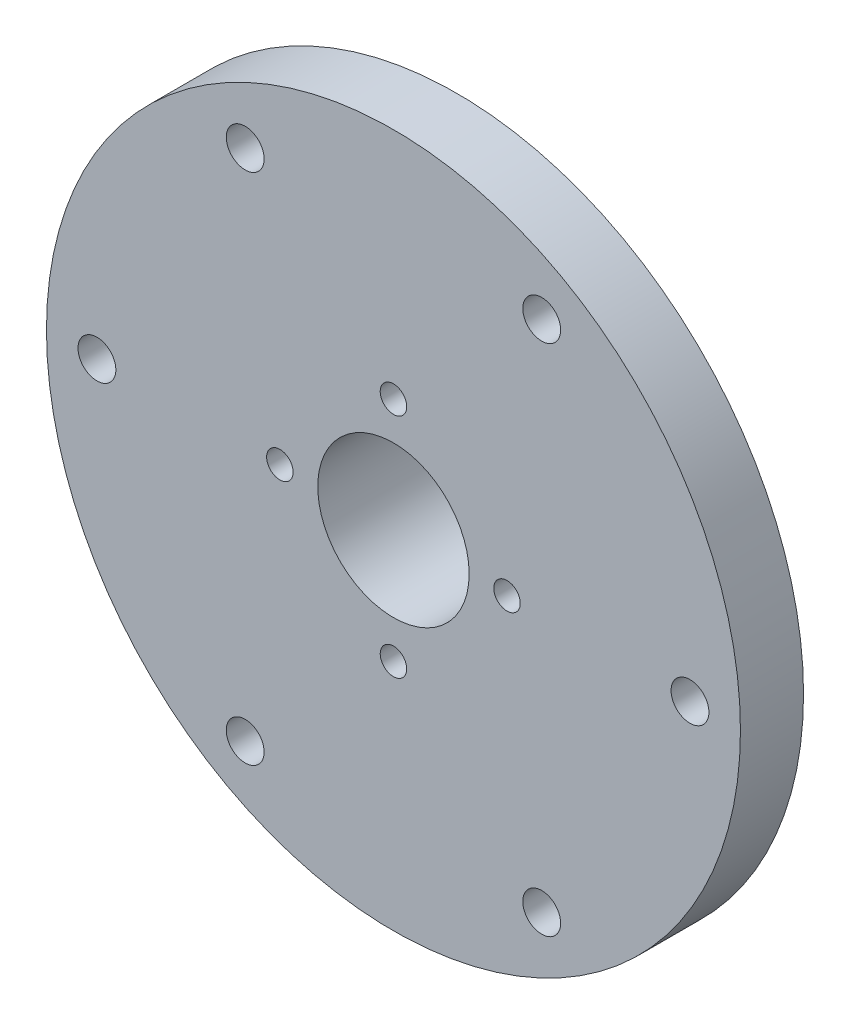
ISO-10303-21;
HEADER;
FILE_DESCRIPTION(('STEP AP214'),'2;1');
FILE_NAME('part.step','',(''),(''),'','','');
FILE_SCHEMA(('AUTOMOTIVE_DESIGN { 1 0 10303 214 1 1 1 1 }'));
ENDSEC;
DATA;
#1=APPLICATION_CONTEXT('core data for automotive mechanical design processes');
#2=APPLICATION_PROTOCOL_DEFINITION('international standard','automotive_design',2000,#1);
#3=PRODUCT_CONTEXT('',#1,'mechanical');
#4=PRODUCT('Part','Part','',(#3));
#5=PRODUCT_RELATED_PRODUCT_CATEGORY('part','',(#4));
#6=PRODUCT_DEFINITION_FORMATION('','',#4);
#7=PRODUCT_DEFINITION_CONTEXT('part definition',#1,'design');
#8=PRODUCT_DEFINITION('design','',#6,#7);
#9=PRODUCT_DEFINITION_SHAPE('','',#8);
#10=(LENGTH_UNIT() NAMED_UNIT(*) SI_UNIT(.MILLI.,.METRE.));
#11=(NAMED_UNIT(*) PLANE_ANGLE_UNIT() SI_UNIT($,.RADIAN.));
#12=(NAMED_UNIT(*) SI_UNIT($,.STERADIAN.) SOLID_ANGLE_UNIT());
#13=UNCERTAINTY_MEASURE_WITH_UNIT(LENGTH_MEASURE(1.E-05),#10,'distance_accuracy_value','');
#14=(GEOMETRIC_REPRESENTATION_CONTEXT(3) GLOBAL_UNCERTAINTY_ASSIGNED_CONTEXT((#13)) GLOBAL_UNIT_ASSIGNED_CONTEXT((#10,
#11,#12)) REPRESENTATION_CONTEXT('',''));
#15=CARTESIAN_POINT('',(0.,0.,0.));
#16=DIRECTION('',(0.,0.,1.));
#17=DIRECTION('',(1.,0.,0.));
#18=AXIS2_PLACEMENT_3D('',#15,#16,#17);
#19=CARTESIAN_POINT('',(0.,0.,0.));
#20=DIRECTION('',(0.,0.,1.));
#21=DIRECTION('',(1.,0.,0.));
#22=AXIS2_PLACEMENT_3D('',#19,#20,#21);
#23=PLANE('',#22);
#24=CARTESIAN_POINT('',(0.,18.,0.));
#25=DIRECTION('',(0.,0.,-1.));
#26=DIRECTION('',(-1.,0.,0.));
#27=AXIS2_PLACEMENT_3D('',#24,#25,#26);
#28=CIRCLE('',#27,2.1);
#29=CARTESIAN_POINT('',(-2.1,18.,0.));
#30=VERTEX_POINT('',#29);
#31=EDGE_CURVE('E150',#30,#30,#28,.T.);
#32=ORIENTED_EDGE('',*,*,#31,.F.);
#33=EDGE_LOOP('',(#32));
#34=FACE_BOUND('',#33,.T.);
#35=CARTESIAN_POINT('',(-18.,0.,0.));
#36=DIRECTION('',(0.,0.,-1.));
#37=DIRECTION('',(-1.,0.,0.));
#38=AXIS2_PLACEMENT_3D('',#35,#36,#37);
#39=CIRCLE('',#38,2.1);
#40=CARTESIAN_POINT('',(-20.1,0.,0.));
#41=VERTEX_POINT('',#40);
#42=EDGE_CURVE('E154',#41,#41,#39,.T.);
#43=ORIENTED_EDGE('',*,*,#42,.F.);
#44=EDGE_LOOP('',(#43));
#45=FACE_BOUND('',#44,.T.);
#46=CARTESIAN_POINT('',(0.,-18.,0.));
#47=DIRECTION('',(0.,0.,-1.));
#48=DIRECTION('',(-1.,0.,0.));
#49=AXIS2_PLACEMENT_3D('',#46,#47,#48);
#50=CIRCLE('',#49,2.1);
#51=CARTESIAN_POINT('',(-2.1,-18.,0.));
#52=VERTEX_POINT('',#51);
#53=EDGE_CURVE('E158',#52,#52,#50,.T.);
#54=ORIENTED_EDGE('',*,*,#53,.F.);
#55=EDGE_LOOP('',(#54));
#56=FACE_BOUND('',#55,.T.);
#57=CARTESIAN_POINT('',(18.,0.,0.));
#58=DIRECTION('',(0.,0.,-1.));
#59=DIRECTION('',(-1.,0.,0.));
#60=AXIS2_PLACEMENT_3D('',#57,#58,#59);
#61=CIRCLE('',#60,2.1);
#62=CARTESIAN_POINT('',(15.9,0.,0.));
#63=VERTEX_POINT('',#62);
#64=EDGE_CURVE('E161',#63,#63,#61,.T.);
#65=ORIENTED_EDGE('',*,*,#64,.F.);
#66=EDGE_LOOP('',(#65));
#67=FACE_BOUND('',#66,.T.);
#68=CARTESIAN_POINT('',(0.,0.,0.));
#69=DIRECTION('',(0.,0.,1.));
#70=DIRECTION('',(1.,0.,0.));
#71=AXIS2_PLACEMENT_3D('',#68,#69,#70);
#72=CIRCLE('',#71,12.);
#73=CARTESIAN_POINT('',(12.,0.,0.));
#74=VERTEX_POINT('',#73);
#75=EDGE_CURVE('E48',#74,#74,#72,.T.);
#76=ORIENTED_EDGE('',*,*,#75,.T.);
#77=EDGE_LOOP('',(#76));
#78=FACE_BOUND('',#77,.T.);
#79=CARTESIAN_POINT('',(0.,0.,0.));
#80=DIRECTION('',(0.,0.,1.));
#81=DIRECTION('',(1.,0.,0.));
#82=AXIS2_PLACEMENT_3D('',#79,#80,#81);
#83=CIRCLE('',#82,25.);
#84=CARTESIAN_POINT('',(25.,0.,0.));
#85=VERTEX_POINT('',#84);
#86=EDGE_CURVE('E87',#85,#85,#83,.T.);
#87=ORIENTED_EDGE('',*,*,#86,.F.);
#88=EDGE_LOOP('',(#87));
#89=FACE_BOUND('',#88,.T.);
#90=ADVANCED_FACE('F35',(#34,#45,#56,#67,#78,#89),#23,.F.);
#91=CARTESIAN_POINT('',(0.,0.,20.));
#92=DIRECTION('',(0.,0.,1.));
#93=DIRECTION('',(1.,0.,0.));
#94=AXIS2_PLACEMENT_3D('',#91,#92,#93);
#95=PLANE('',#94);
#96=CARTESIAN_POINT('',(0.,18.,20.));
#97=DIRECTION('',(0.,0.,-1.));
#98=DIRECTION('',(-1.,0.,0.));
#99=AXIS2_PLACEMENT_3D('',#96,#97,#98);
#100=CIRCLE('',#99,2.1);
#101=CARTESIAN_POINT('',(-2.1,18.,20.));
#102=VERTEX_POINT('',#101);
#103=EDGE_CURVE('E417',#102,#102,#100,.T.);
#104=ORIENTED_EDGE('',*,*,#103,.T.);
#105=EDGE_LOOP('',(#104));
#106=FACE_BOUND('',#105,.T.);
#107=CARTESIAN_POINT('',(-18.,0.,20.));
#108=DIRECTION('',(0.,0.,-1.));
#109=DIRECTION('',(-1.,0.,0.));
#110=AXIS2_PLACEMENT_3D('',#107,#108,#109);
#111=CIRCLE('',#110,2.09999999999999);
#112=CARTESIAN_POINT('',(-20.1,0.,20.));
#113=VERTEX_POINT('',#112);
#114=EDGE_CURVE('E422',#113,#113,#111,.T.);
#115=ORIENTED_EDGE('',*,*,#114,.T.);
#116=EDGE_LOOP('',(#115));
#117=FACE_BOUND('',#116,.T.);
#118=CARTESIAN_POINT('',(0.,-18.,20.));
#119=DIRECTION('',(0.,0.,-1.));
#120=DIRECTION('',(-1.,0.,0.));
#121=AXIS2_PLACEMENT_3D('',#118,#119,#120);
#122=CIRCLE('',#121,2.1);
#123=CARTESIAN_POINT('',(-2.1,-18.,20.));
#124=VERTEX_POINT('',#123);
#125=EDGE_CURVE('E164',#124,#124,#122,.T.);
#126=ORIENTED_EDGE('',*,*,#125,.T.);
#127=EDGE_LOOP('',(#126));
#128=FACE_BOUND('',#127,.T.);
#129=CARTESIAN_POINT('',(18.,0.,20.));
#130=DIRECTION('',(0.,0.,-1.));
#131=DIRECTION('',(-1.,0.,0.));
#132=AXIS2_PLACEMENT_3D('',#129,#130,#131);
#133=CIRCLE('',#132,2.09999999999999);
#134=CARTESIAN_POINT('',(15.9,0.,20.));
#135=VERTEX_POINT('',#134);
#136=EDGE_CURVE('E163',#135,#135,#133,.T.);
#137=ORIENTED_EDGE('',*,*,#136,.T.);
#138=EDGE_LOOP('',(#137));
#139=FACE_BOUND('',#138,.T.);
#140=CARTESIAN_POINT('',(-23.4999999999996,40.7031939778688,20.));
#141=DIRECTION('',(0.,0.,1.));
#142=DIRECTION('',(1.,0.,0.));
#143=AXIS2_PLACEMENT_3D('',#140,#141,#142);
#144=CIRCLE('',#143,3.);
#145=CARTESIAN_POINT('',(-20.4999999999996,40.7031939778688,20.));
#146=VERTEX_POINT('',#145);
#147=EDGE_CURVE('E105',#146,#146,#144,.T.);
#148=ORIENTED_EDGE('',*,*,#147,.F.);
#149=EDGE_LOOP('',(#148));
#150=FACE_BOUND('',#149,.T.);
#151=CARTESIAN_POINT('',(-23.5000000000002,-40.7031939778685,20.));
#152=DIRECTION('',(0.,0.,1.));
#153=DIRECTION('',(1.,0.,0.));
#154=AXIS2_PLACEMENT_3D('',#151,#152,#153);
#155=CIRCLE('',#154,3.);
#156=CARTESIAN_POINT('',(-20.5000000000002,-40.7031939778685,20.));
#157=VERTEX_POINT('',#156);
#158=EDGE_CURVE('E111',#157,#157,#155,.T.);
#159=ORIENTED_EDGE('',*,*,#158,.F.);
#160=EDGE_LOOP('',(#159));
#161=FACE_BOUND('',#160,.T.);
#162=CARTESIAN_POINT('',(47.,0.,20.));
#163=DIRECTION('',(0.,0.,1.));
#164=DIRECTION('',(1.,0.,0.));
#165=AXIS2_PLACEMENT_3D('',#162,#163,#164);
#166=CIRCLE('',#165,3.);
#167=CARTESIAN_POINT('',(50.,0.,20.));
#168=VERTEX_POINT('',#167);
#169=EDGE_CURVE('E117',#168,#168,#166,.T.);
#170=ORIENTED_EDGE('',*,*,#169,.F.);
#171=EDGE_LOOP('',(#170));
#172=FACE_BOUND('',#171,.T.);
#173=CARTESIAN_POINT('',(0.,0.,20.));
#174=DIRECTION('',(0.,0.,1.));
#175=DIRECTION('',(1.,0.,0.));
#176=AXIS2_PLACEMENT_3D('',#173,#174,#175);
#177=CIRCLE('',#176,55.);
#178=CARTESIAN_POINT('',(55.,0.,20.));
#179=VERTEX_POINT('',#178);
#180=EDGE_CURVE('E11',#179,#179,#177,.T.);
#181=ORIENTED_EDGE('',*,*,#180,.T.);
#182=EDGE_LOOP('',(#181));
#183=FACE_BOUND('',#182,.T.);
#184=CARTESIAN_POINT('',(0.,0.,20.));
#185=DIRECTION('',(0.,0.,1.));
#186=DIRECTION('',(1.,0.,0.));
#187=AXIS2_PLACEMENT_3D('',#184,#185,#186);
#188=CIRCLE('',#187,12.);
#189=CARTESIAN_POINT('',(12.,0.,20.));
#190=VERTEX_POINT('',#189);
#191=EDGE_CURVE('E43',#190,#190,#188,.T.);
#192=ORIENTED_EDGE('',*,*,#191,.F.);
#193=EDGE_LOOP('',(#192));
#194=FACE_BOUND('',#193,.T.);
#195=CARTESIAN_POINT('',(23.4999999999999,-40.7031939778687,20.));
#196=DIRECTION('',(0.,0.,1.));
#197=DIRECTION('',(1.,0.,0.));
#198=AXIS2_PLACEMENT_3D('',#195,#196,#197);
#199=CIRCLE('',#198,3.);
#200=CARTESIAN_POINT('',(26.4999999999999,-40.7031939778687,20.));
#201=VERTEX_POINT('',#200);
#202=EDGE_CURVE('E114',#201,#201,#199,.T.);
#203=ORIENTED_EDGE('',*,*,#202,.F.);
#204=EDGE_LOOP('',(#203));
#205=FACE_BOUND('',#204,.T.);
#206=CARTESIAN_POINT('',(-47.,3.28199245851255E-13,20.));
#207=DIRECTION('',(0.,0.,1.));
#208=DIRECTION('',(1.,0.,0.));
#209=AXIS2_PLACEMENT_3D('',#206,#207,#208);
#210=CIRCLE('',#209,3.);
#211=CARTESIAN_POINT('',(-44.,3.28199245851255E-13,20.));
#212=VERTEX_POINT('',#211);
#213=EDGE_CURVE('E108',#212,#212,#210,.T.);
#214=ORIENTED_EDGE('',*,*,#213,.F.);
#215=EDGE_LOOP('',(#214));
#216=FACE_BOUND('',#215,.T.);
#217=CARTESIAN_POINT('',(23.5000000000005,40.7031939778683,20.));
#218=DIRECTION('',(0.,0.,1.));
#219=DIRECTION('',(1.,0.,0.));
#220=AXIS2_PLACEMENT_3D('',#217,#218,#219);
#221=CIRCLE('',#220,3.00000000000001);
#222=CARTESIAN_POINT('',(26.5000000000005,40.7031939778683,20.));
#223=VERTEX_POINT('',#222);
#224=EDGE_CURVE('E102',#223,#223,#221,.T.);
#225=ORIENTED_EDGE('',*,*,#224,.F.);
#226=EDGE_LOOP('',(#225));
#227=FACE_BOUND('',#226,.T.);
#228=ADVANCED_FACE('F138',(#106,#117,#128,#139,#150,#161,#172,#183,#194,#205,#216,#227),#95,.T.);
#229=CARTESIAN_POINT('',(0.,0.,20.));
#230=DIRECTION('',(0.,0.,-1.));
#231=DIRECTION('',(-1.,0.,0.));
#232=AXIS2_PLACEMENT_3D('',#229,#230,#231);
#233=CYLINDRICAL_SURFACE('',#232,55.);
#234=CARTESIAN_POINT('',(0.,0.,10.));
#235=DIRECTION('',(0.,0.,1.));
#236=DIRECTION('',(1.,0.,0.));
#237=AXIS2_PLACEMENT_3D('',#234,#235,#236);
#238=CIRCLE('',#237,55.);
#239=CARTESIAN_POINT('',(55.,0.,10.));
#240=VERTEX_POINT('',#239);
#241=EDGE_CURVE('E96',#240,#240,#238,.T.);
#242=ORIENTED_EDGE('',*,*,#241,.T.);
#243=EDGE_LOOP('',(#242));
#244=FACE_BOUND('',#243,.T.);
#245=ORIENTED_EDGE('',*,*,#180,.F.);
#246=EDGE_LOOP('',(#245));
#247=FACE_BOUND('',#246,.T.);
#248=ADVANCED_FACE('F37',(#244,#247),#233,.T.);
#249=CARTESIAN_POINT('',(0.,0.,20.));
#250=DIRECTION('',(0.,0.,-1.));
#251=DIRECTION('',(-1.,0.,0.));
#252=AXIS2_PLACEMENT_3D('',#249,#250,#251);
#253=CYLINDRICAL_SURFACE('',#252,12.);
#254=ORIENTED_EDGE('',*,*,#191,.T.);
#255=EDGE_LOOP('',(#254));
#256=FACE_BOUND('',#255,.T.);
#257=ORIENTED_EDGE('',*,*,#75,.F.);
#258=EDGE_LOOP('',(#257));
#259=FACE_BOUND('',#258,.T.);
#260=ADVANCED_FACE('F126',(#256,#259),#253,.F.);
#261=CARTESIAN_POINT('',(47.,0.,20.));
#262=DIRECTION('',(0.,0.,-1.));
#263=DIRECTION('',(-1.,0.,0.));
#264=AXIS2_PLACEMENT_3D('',#261,#262,#263);
#265=CYLINDRICAL_SURFACE('',#264,3.);
#266=CARTESIAN_POINT('',(47.,0.,15.));
#267=DIRECTION('',(0.,0.,1.));
#268=DIRECTION('',(1.,0.,0.));
#269=AXIS2_PLACEMENT_3D('',#266,#267,#268);
#270=CIRCLE('',#269,3.);
#271=CARTESIAN_POINT('',(50.,0.,15.));
#272=VERTEX_POINT('',#271);
#273=EDGE_CURVE('E39',#272,#272,#270,.T.);
#274=ORIENTED_EDGE('',*,*,#273,.F.);
#275=EDGE_LOOP('',(#274));
#276=FACE_BOUND('',#275,.T.);
#277=ORIENTED_EDGE('',*,*,#169,.T.);
#278=EDGE_LOOP('',(#277));
#279=FACE_BOUND('',#278,.T.);
#280=ADVANCED_FACE('F128',(#276,#279),#265,.F.);
#281=CARTESIAN_POINT('',(23.4999999999999,-40.7031939778687,20.));
#282=DIRECTION('',(0.,0.,-1.));
#283=DIRECTION('',(-1.,0.,0.));
#284=AXIS2_PLACEMENT_3D('',#281,#282,#283);
#285=CYLINDRICAL_SURFACE('',#284,3.);
#286=CARTESIAN_POINT('',(23.4999999999999,-40.7031939778687,15.));
#287=DIRECTION('',(0.,0.,1.));
#288=DIRECTION('',(1.,0.,0.));
#289=AXIS2_PLACEMENT_3D('',#286,#287,#288);
#290=CIRCLE('',#289,3.);
#291=CARTESIAN_POINT('',(26.4999999999999,-40.7031939778687,15.));
#292=VERTEX_POINT('',#291);
#293=EDGE_CURVE('E82',#292,#292,#290,.T.);
#294=ORIENTED_EDGE('',*,*,#293,.F.);
#295=EDGE_LOOP('',(#294));
#296=FACE_BOUND('',#295,.T.);
#297=ORIENTED_EDGE('',*,*,#202,.T.);
#298=EDGE_LOOP('',(#297));
#299=FACE_BOUND('',#298,.T.);
#300=ADVANCED_FACE('F135',(#296,#299),#285,.F.);
#301=CARTESIAN_POINT('',(-23.5000000000002,-40.7031939778685,20.));
#302=DIRECTION('',(0.,0.,-1.));
#303=DIRECTION('',(-1.,0.,0.));
#304=AXIS2_PLACEMENT_3D('',#301,#302,#303);
#305=CYLINDRICAL_SURFACE('',#304,3.);
#306=CARTESIAN_POINT('',(-23.5000000000002,-40.7031939778685,15.));
#307=DIRECTION('',(0.,0.,1.));
#308=DIRECTION('',(1.,0.,0.));
#309=AXIS2_PLACEMENT_3D('',#306,#307,#308);
#310=CIRCLE('',#309,3.);
#311=CARTESIAN_POINT('',(-20.5000000000002,-40.7031939778685,15.));
#312=VERTEX_POINT('',#311);
#313=EDGE_CURVE('E80',#312,#312,#310,.T.);
#314=ORIENTED_EDGE('',*,*,#313,.F.);
#315=EDGE_LOOP('',(#314));
#316=FACE_BOUND('',#315,.T.);
#317=ORIENTED_EDGE('',*,*,#158,.T.);
#318=EDGE_LOOP('',(#317));
#319=FACE_BOUND('',#318,.T.);
#320=ADVANCED_FACE('F229',(#316,#319),#305,.F.);
#321=CARTESIAN_POINT('',(-47.,3.28199245851255E-13,20.));
#322=DIRECTION('',(0.,0.,-1.));
#323=DIRECTION('',(-1.,0.,0.));
#324=AXIS2_PLACEMENT_3D('',#321,#322,#323);
#325=CYLINDRICAL_SURFACE('',#324,3.);
#326=CARTESIAN_POINT('',(-47.,3.28199245851255E-13,15.));
#327=DIRECTION('',(0.,0.,1.));
#328=DIRECTION('',(1.,0.,0.));
#329=AXIS2_PLACEMENT_3D('',#326,#327,#328);
#330=CIRCLE('',#329,3.);
#331=CARTESIAN_POINT('',(-44.,3.28199245851255E-13,15.));
#332=VERTEX_POINT('',#331);
#333=EDGE_CURVE('E77',#332,#332,#330,.T.);
#334=ORIENTED_EDGE('',*,*,#333,.F.);
#335=EDGE_LOOP('',(#334));
#336=FACE_BOUND('',#335,.T.);
#337=ORIENTED_EDGE('',*,*,#213,.T.);
#338=EDGE_LOOP('',(#337));
#339=FACE_BOUND('',#338,.T.);
#340=ADVANCED_FACE('F225',(#336,#339),#325,.F.);
#341=CARTESIAN_POINT('',(-23.4999999999996,40.7031939778688,20.));
#342=DIRECTION('',(0.,0.,-1.));
#343=DIRECTION('',(-1.,0.,0.));
#344=AXIS2_PLACEMENT_3D('',#341,#342,#343);
#345=CYLINDRICAL_SURFACE('',#344,3.);
#346=CARTESIAN_POINT('',(-23.4999999999996,40.7031939778688,15.));
#347=DIRECTION('',(0.,0.,1.));
#348=DIRECTION('',(1.,0.,0.));
#349=AXIS2_PLACEMENT_3D('',#346,#347,#348);
#350=CIRCLE('',#349,3.);
#351=CARTESIAN_POINT('',(-20.4999999999996,40.7031939778688,15.));
#352=VERTEX_POINT('',#351);
#353=EDGE_CURVE('E74',#352,#352,#350,.T.);
#354=ORIENTED_EDGE('',*,*,#353,.F.);
#355=EDGE_LOOP('',(#354));
#356=FACE_BOUND('',#355,.T.);
#357=ORIENTED_EDGE('',*,*,#147,.T.);
#358=EDGE_LOOP('',(#357));
#359=FACE_BOUND('',#358,.T.);
#360=ADVANCED_FACE('F221',(#356,#359),#345,.F.);
#361=CARTESIAN_POINT('',(23.5000000000005,40.7031939778683,20.));
#362=DIRECTION('',(0.,0.,-1.));
#363=DIRECTION('',(-1.,0.,0.));
#364=AXIS2_PLACEMENT_3D('',#361,#362,#363);
#365=CYLINDRICAL_SURFACE('',#364,3.00000000000001);
#366=CARTESIAN_POINT('',(23.5000000000005,40.7031939778683,15.));
#367=DIRECTION('',(0.,0.,1.));
#368=DIRECTION('',(1.,0.,0.));
#369=AXIS2_PLACEMENT_3D('',#366,#367,#368);
#370=CIRCLE('',#369,3.00000000000001);
#371=CARTESIAN_POINT('',(26.5000000000005,40.7031939778683,15.));
#372=VERTEX_POINT('',#371);
#373=EDGE_CURVE('E71',#372,#372,#370,.T.);
#374=ORIENTED_EDGE('',*,*,#373,.F.);
#375=EDGE_LOOP('',(#374));
#376=FACE_BOUND('',#375,.T.);
#377=ORIENTED_EDGE('',*,*,#224,.T.);
#378=EDGE_LOOP('',(#377));
#379=FACE_BOUND('',#378,.T.);
#380=ADVANCED_FACE('F217',(#376,#379),#365,.F.);
#381=CARTESIAN_POINT('',(0.,0.,10.));
#382=DIRECTION('',(0.,0.,1.));
#383=DIRECTION('',(1.,0.,0.));
#384=AXIS2_PLACEMENT_3D('',#381,#382,#383);
#385=PLANE('',#384);
#386=CARTESIAN_POINT('',(-47.,0.,10.));
#387=DIRECTION('',(0.,0.,1.));
#388=DIRECTION('',(1.,0.,0.));
#389=AXIS2_PLACEMENT_3D('',#386,#387,#388);
#390=CIRCLE('',#389,5.);
#391=CARTESIAN_POINT('',(-42.,0.,10.));
#392=VERTEX_POINT('',#391);
#393=EDGE_CURVE('E68',#392,#392,#390,.F.);
#394=ORIENTED_EDGE('',*,*,#393,.F.);
#395=EDGE_LOOP('',(#394));
#396=FACE_BOUND('',#395,.T.);
#397=CARTESIAN_POINT('',(-23.5000000000005,-40.7031939778683,10.));
#398=DIRECTION('',(0.,0.,1.));
#399=DIRECTION('',(1.,0.,0.));
#400=AXIS2_PLACEMENT_3D('',#397,#398,#399);
#401=CIRCLE('',#400,5.);
#402=CARTESIAN_POINT('',(-18.5000000000005,-40.7031939778683,10.));
#403=VERTEX_POINT('',#402);
#404=EDGE_CURVE('E65',#403,#403,#401,.F.);
#405=ORIENTED_EDGE('',*,*,#404,.F.);
#406=EDGE_LOOP('',(#405));
#407=FACE_BOUND('',#406,.T.);
#408=CARTESIAN_POINT('',(23.4999999999996,-40.7031939778688,10.));
#409=DIRECTION('',(0.,0.,1.));
#410=DIRECTION('',(1.,0.,0.));
#411=AXIS2_PLACEMENT_3D('',#408,#409,#410);
#412=CIRCLE('',#411,5.);
#413=CARTESIAN_POINT('',(28.4999999999996,-40.7031939778688,10.));
#414=VERTEX_POINT('',#413);
#415=EDGE_CURVE('E62',#414,#414,#412,.F.);
#416=ORIENTED_EDGE('',*,*,#415,.F.);
#417=EDGE_LOOP('',(#416));
#418=FACE_BOUND('',#417,.T.);
#419=CARTESIAN_POINT('',(47.,-3.28199245851255E-13,10.));
#420=DIRECTION('',(0.,0.,1.));
#421=DIRECTION('',(1.,0.,0.));
#422=AXIS2_PLACEMENT_3D('',#419,#420,#421);
#423=CIRCLE('',#422,4.99999999999999);
#424=CARTESIAN_POINT('',(52.,-3.28199245851255E-13,10.));
#425=VERTEX_POINT('',#424);
#426=EDGE_CURVE('E59',#425,#425,#423,.F.);
#427=ORIENTED_EDGE('',*,*,#426,.F.);
#428=EDGE_LOOP('',(#427));
#429=FACE_BOUND('',#428,.T.);
#430=CARTESIAN_POINT('',(23.5000000000002,40.7031939778685,10.));
#431=DIRECTION('',(0.,0.,1.));
#432=DIRECTION('',(1.,0.,0.));
#433=AXIS2_PLACEMENT_3D('',#430,#431,#432);
#434=CIRCLE('',#433,5.);
#435=CARTESIAN_POINT('',(28.5000000000002,40.7031939778685,10.));
#436=VERTEX_POINT('',#435);
#437=EDGE_CURVE('E55',#436,#436,#434,.F.);
#438=ORIENTED_EDGE('',*,*,#437,.F.);
#439=EDGE_LOOP('',(#438));
#440=FACE_BOUND('',#439,.T.);
#441=CARTESIAN_POINT('',(-23.4999999999999,40.7031939778687,10.));
#442=DIRECTION('',(0.,0.,1.));
#443=DIRECTION('',(1.,0.,0.));
#444=AXIS2_PLACEMENT_3D('',#441,#442,#443);
#445=CIRCLE('',#444,5.);
#446=CARTESIAN_POINT('',(-18.4999999999999,40.7031939778687,10.));
#447=VERTEX_POINT('',#446);
#448=EDGE_CURVE('E52',#447,#447,#445,.F.);
#449=ORIENTED_EDGE('',*,*,#448,.F.);
#450=EDGE_LOOP('',(#449));
#451=FACE_BOUND('',#450,.T.);
#452=CARTESIAN_POINT('',(0.,0.,10.));
#453=DIRECTION('',(0.,0.,1.));
#454=DIRECTION('',(1.,0.,0.));
#455=AXIS2_PLACEMENT_3D('',#452,#453,#454);
#456=CIRCLE('',#455,25.);
#457=CARTESIAN_POINT('',(25.,0.,10.));
#458=VERTEX_POINT('',#457);
#459=EDGE_CURVE('E91',#458,#458,#456,.T.);
#460=ORIENTED_EDGE('',*,*,#459,.T.);
#461=EDGE_LOOP('',(#460));
#462=FACE_BOUND('',#461,.T.);
#463=ORIENTED_EDGE('',*,*,#241,.F.);
#464=EDGE_LOOP('',(#463));
#465=FACE_BOUND('',#464,.T.);
#466=ADVANCED_FACE('F213',(#396,#407,#418,#429,#440,#451,#462,#465),#385,.F.);
#467=CARTESIAN_POINT('',(0.,0.,10.));
#468=DIRECTION('',(0.,0.,-1.));
#469=DIRECTION('',(-1.,0.,0.));
#470=AXIS2_PLACEMENT_3D('',#467,#468,#469);
#471=CYLINDRICAL_SURFACE('',#470,25.);
#472=ORIENTED_EDGE('',*,*,#459,.F.);
#473=EDGE_LOOP('',(#472));
#474=FACE_BOUND('',#473,.T.);
#475=ORIENTED_EDGE('',*,*,#86,.T.);
#476=EDGE_LOOP('',(#475));
#477=FACE_BOUND('',#476,.T.);
#478=ADVANCED_FACE('F209',(#474,#477),#471,.T.);
#479=CARTESIAN_POINT('',(-23.4999999999999,40.7031939778687,15.));
#480=DIRECTION('',(0.,0.,-1.));
#481=DIRECTION('',(-1.,0.,0.));
#482=AXIS2_PLACEMENT_3D('',#479,#480,#481);
#483=CYLINDRICAL_SURFACE('',#482,5.);
#484=CARTESIAN_POINT('',(-23.4999999999999,40.7031939778687,15.));
#485=DIRECTION('',(0.,0.,1.));
#486=DIRECTION('',(1.,0.,0.));
#487=AXIS2_PLACEMENT_3D('',#484,#485,#486);
#488=CIRCLE('',#487,5.);
#489=CARTESIAN_POINT('',(-18.4999999999999,40.7031939778687,15.));
#490=VERTEX_POINT('',#489);
#491=EDGE_CURVE('E175',#490,#490,#488,.T.);
#492=ORIENTED_EDGE('',*,*,#491,.T.);
#493=EDGE_LOOP('',(#492));
#494=FACE_BOUND('',#493,.T.);
#495=ORIENTED_EDGE('',*,*,#448,.T.);
#496=EDGE_LOOP('',(#495));
#497=FACE_BOUND('',#496,.T.);
#498=ADVANCED_FACE('F212',(#494,#497),#483,.F.);
#499=CARTESIAN_POINT('',(-23.4999999999999,40.7031939778687,15.));
#500=DIRECTION('',(0.,0.,1.));
#501=DIRECTION('',(1.,0.,0.));
#502=AXIS2_PLACEMENT_3D('',#499,#500,#501);
#503=PLANE('',#502);
#504=ORIENTED_EDGE('',*,*,#353,.T.);
#505=EDGE_LOOP('',(#504));
#506=FACE_BOUND('',#505,.T.);
#507=ORIENTED_EDGE('',*,*,#491,.F.);
#508=EDGE_LOOP('',(#507));
#509=FACE_BOUND('',#508,.T.);
#510=ADVANCED_FACE('F280',(#506,#509),#503,.F.);
#511=CARTESIAN_POINT('',(23.5000000000002,40.7031939778685,15.));
#512=DIRECTION('',(0.,0.,-1.));
#513=DIRECTION('',(-1.,0.,0.));
#514=AXIS2_PLACEMENT_3D('',#511,#512,#513);
#515=CYLINDRICAL_SURFACE('',#514,5.);
#516=CARTESIAN_POINT('',(23.5000000000002,40.7031939778685,15.));
#517=DIRECTION('',(0.,0.,1.));
#518=DIRECTION('',(1.,0.,0.));
#519=AXIS2_PLACEMENT_3D('',#516,#517,#518);
#520=CIRCLE('',#519,5.);
#521=CARTESIAN_POINT('',(28.5000000000002,40.7031939778685,15.));
#522=VERTEX_POINT('',#521);
#523=EDGE_CURVE('E181',#522,#522,#520,.T.);
#524=ORIENTED_EDGE('',*,*,#523,.T.);
#525=EDGE_LOOP('',(#524));
#526=FACE_BOUND('',#525,.T.);
#527=ORIENTED_EDGE('',*,*,#437,.T.);
#528=EDGE_LOOP('',(#527));
#529=FACE_BOUND('',#528,.T.);
#530=ADVANCED_FACE('F288',(#526,#529),#515,.F.);
#531=CARTESIAN_POINT('',(23.5000000000002,40.7031939778685,15.));
#532=DIRECTION('',(0.,0.,1.));
#533=DIRECTION('',(1.,0.,0.));
#534=AXIS2_PLACEMENT_3D('',#531,#532,#533);
#535=PLANE('',#534);
#536=ORIENTED_EDGE('',*,*,#373,.T.);
#537=EDGE_LOOP('',(#536));
#538=FACE_BOUND('',#537,.T.);
#539=ORIENTED_EDGE('',*,*,#523,.F.);
#540=EDGE_LOOP('',(#539));
#541=FACE_BOUND('',#540,.T.);
#542=ADVANCED_FACE('F296',(#538,#541),#535,.F.);
#543=CARTESIAN_POINT('',(47.,-3.28199245851255E-13,15.));
#544=DIRECTION('',(0.,0.,-1.));
#545=DIRECTION('',(-1.,0.,0.));
#546=AXIS2_PLACEMENT_3D('',#543,#544,#545);
#547=CYLINDRICAL_SURFACE('',#546,4.99999999999999);
#548=CARTESIAN_POINT('',(47.,-3.28199245851255E-13,15.));
#549=DIRECTION('',(0.,0.,1.));
#550=DIRECTION('',(1.,0.,0.));
#551=AXIS2_PLACEMENT_3D('',#548,#549,#550);
#552=CIRCLE('',#551,4.99999999999999);
#553=CARTESIAN_POINT('',(52.,-3.28199245851255E-13,15.));
#554=VERTEX_POINT('',#553);
#555=EDGE_CURVE('E184',#554,#554,#552,.T.);
#556=ORIENTED_EDGE('',*,*,#555,.T.);
#557=EDGE_LOOP('',(#556));
#558=FACE_BOUND('',#557,.T.);
#559=ORIENTED_EDGE('',*,*,#426,.T.);
#560=EDGE_LOOP('',(#559));
#561=FACE_BOUND('',#560,.T.);
#562=ADVANCED_FACE('F206',(#558,#561),#547,.F.);
#563=CARTESIAN_POINT('',(47.,-3.28199245851255E-13,15.));
#564=DIRECTION('',(0.,0.,1.));
#565=DIRECTION('',(1.,0.,0.));
#566=AXIS2_PLACEMENT_3D('',#563,#564,#565);
#567=PLANE('',#566);
#568=ORIENTED_EDGE('',*,*,#273,.T.);
#569=EDGE_LOOP('',(#568));
#570=FACE_BOUND('',#569,.T.);
#571=ORIENTED_EDGE('',*,*,#555,.F.);
#572=EDGE_LOOP('',(#571));
#573=FACE_BOUND('',#572,.T.);
#574=ADVANCED_FACE('F203',(#570,#573),#567,.F.);
#575=CARTESIAN_POINT('',(23.4999999999996,-40.7031939778688,15.));
#576=DIRECTION('',(0.,0.,-1.));
#577=DIRECTION('',(-1.,0.,0.));
#578=AXIS2_PLACEMENT_3D('',#575,#576,#577);
#579=CYLINDRICAL_SURFACE('',#578,5.);
#580=CARTESIAN_POINT('',(23.4999999999996,-40.7031939778688,15.));
#581=DIRECTION('',(0.,0.,1.));
#582=DIRECTION('',(1.,0.,0.));
#583=AXIS2_PLACEMENT_3D('',#580,#581,#582);
#584=CIRCLE('',#583,5.);
#585=CARTESIAN_POINT('',(28.4999999999996,-40.7031939778688,15.));
#586=VERTEX_POINT('',#585);
#587=EDGE_CURVE('E178',#586,#586,#584,.T.);
#588=ORIENTED_EDGE('',*,*,#587,.T.);
#589=EDGE_LOOP('',(#588));
#590=FACE_BOUND('',#589,.T.);
#591=ORIENTED_EDGE('',*,*,#415,.T.);
#592=EDGE_LOOP('',(#591));
#593=FACE_BOUND('',#592,.T.);
#594=ADVANCED_FACE('F189',(#590,#593),#579,.F.);
#595=CARTESIAN_POINT('',(23.4999999999996,-40.7031939778688,15.));
#596=DIRECTION('',(0.,0.,1.));
#597=DIRECTION('',(1.,0.,0.));
#598=AXIS2_PLACEMENT_3D('',#595,#596,#597);
#599=PLANE('',#598);
#600=ORIENTED_EDGE('',*,*,#293,.T.);
#601=EDGE_LOOP('',(#600));
#602=FACE_BOUND('',#601,.T.);
#603=ORIENTED_EDGE('',*,*,#587,.F.);
#604=EDGE_LOOP('',(#603));
#605=FACE_BOUND('',#604,.T.);
#606=ADVANCED_FACE('F192',(#602,#605),#599,.F.);
#607=CARTESIAN_POINT('',(-23.5000000000005,-40.7031939778683,15.));
#608=DIRECTION('',(0.,0.,-1.));
#609=DIRECTION('',(-1.,0.,0.));
#610=AXIS2_PLACEMENT_3D('',#607,#608,#609);
#611=CYLINDRICAL_SURFACE('',#610,5.);
#612=CARTESIAN_POINT('',(-23.5000000000005,-40.7031939778683,15.));
#613=DIRECTION('',(0.,0.,1.));
#614=DIRECTION('',(1.,0.,0.));
#615=AXIS2_PLACEMENT_3D('',#612,#613,#614);
#616=CIRCLE('',#615,5.);
#617=CARTESIAN_POINT('',(-18.5000000000005,-40.7031939778683,15.));
#618=VERTEX_POINT('',#617);
#619=EDGE_CURVE('E167',#618,#618,#616,.T.);
#620=ORIENTED_EDGE('',*,*,#619,.T.);
#621=EDGE_LOOP('',(#620));
#622=FACE_BOUND('',#621,.T.);
#623=ORIENTED_EDGE('',*,*,#404,.T.);
#624=EDGE_LOOP('',(#623));
#625=FACE_BOUND('',#624,.T.);
#626=ADVANCED_FACE('F194',(#622,#625),#611,.F.);
#627=CARTESIAN_POINT('',(-23.5000000000005,-40.7031939778683,15.));
#628=DIRECTION('',(0.,0.,1.));
#629=DIRECTION('',(1.,0.,0.));
#630=AXIS2_PLACEMENT_3D('',#627,#628,#629);
#631=PLANE('',#630);
#632=ORIENTED_EDGE('',*,*,#313,.T.);
#633=EDGE_LOOP('',(#632));
#634=FACE_BOUND('',#633,.T.);
#635=ORIENTED_EDGE('',*,*,#619,.F.);
#636=EDGE_LOOP('',(#635));
#637=FACE_BOUND('',#636,.T.);
#638=ADVANCED_FACE('F200',(#634,#637),#631,.F.);
#639=CARTESIAN_POINT('',(-47.,0.,15.));
#640=DIRECTION('',(0.,0.,-1.));
#641=DIRECTION('',(-1.,0.,0.));
#642=AXIS2_PLACEMENT_3D('',#639,#640,#641);
#643=CYLINDRICAL_SURFACE('',#642,5.);
#644=CARTESIAN_POINT('',(-47.,0.,15.));
#645=DIRECTION('',(0.,0.,1.));
#646=DIRECTION('',(1.,0.,0.));
#647=AXIS2_PLACEMENT_3D('',#644,#645,#646);
#648=CIRCLE('',#647,5.);
#649=CARTESIAN_POINT('',(-42.,0.,15.));
#650=VERTEX_POINT('',#649);
#651=EDGE_CURVE('E56',#650,#650,#648,.T.);
#652=ORIENTED_EDGE('',*,*,#651,.T.);
#653=EDGE_LOOP('',(#652));
#654=FACE_BOUND('',#653,.T.);
#655=ORIENTED_EDGE('',*,*,#393,.T.);
#656=EDGE_LOOP('',(#655));
#657=FACE_BOUND('',#656,.T.);
#658=ADVANCED_FACE('F339',(#654,#657),#643,.F.);
#659=CARTESIAN_POINT('',(-47.,0.,15.));
#660=DIRECTION('',(0.,0.,1.));
#661=DIRECTION('',(1.,0.,0.));
#662=AXIS2_PLACEMENT_3D('',#659,#660,#661);
#663=PLANE('',#662);
#664=ORIENTED_EDGE('',*,*,#333,.T.);
#665=EDGE_LOOP('',(#664));
#666=FACE_BOUND('',#665,.T.);
#667=ORIENTED_EDGE('',*,*,#651,.F.);
#668=EDGE_LOOP('',(#667));
#669=FACE_BOUND('',#668,.T.);
#670=ADVANCED_FACE('F349',(#666,#669),#663,.F.);
#671=CARTESIAN_POINT('',(18.,0.,0.));
#672=DIRECTION('',(0.,0.,-1.));
#673=DIRECTION('',(-1.,0.,0.));
#674=AXIS2_PLACEMENT_3D('',#671,#672,#673);
#675=CYLINDRICAL_SURFACE('',#674,2.1);
#676=ORIENTED_EDGE('',*,*,#136,.F.);
#677=EDGE_LOOP('',(#676));
#678=FACE_BOUND('',#677,.T.);
#679=ORIENTED_EDGE('',*,*,#64,.T.);
#680=EDGE_LOOP('',(#679));
#681=FACE_BOUND('',#680,.T.);
#682=ADVANCED_FACE('F358',(#678,#681),#675,.F.);
#683=CARTESIAN_POINT('',(0.,-18.,0.));
#684=DIRECTION('',(0.,0.,-1.));
#685=DIRECTION('',(-1.,0.,0.));
#686=AXIS2_PLACEMENT_3D('',#683,#684,#685);
#687=CYLINDRICAL_SURFACE('',#686,2.1);
#688=ORIENTED_EDGE('',*,*,#125,.F.);
#689=EDGE_LOOP('',(#688));
#690=FACE_BOUND('',#689,.T.);
#691=ORIENTED_EDGE('',*,*,#53,.T.);
#692=EDGE_LOOP('',(#691));
#693=FACE_BOUND('',#692,.T.);
#694=ADVANCED_FACE('F380',(#690,#693),#687,.F.);
#695=CARTESIAN_POINT('',(-18.,0.,0.));
#696=DIRECTION('',(0.,0.,-1.));
#697=DIRECTION('',(-1.,0.,0.));
#698=AXIS2_PLACEMENT_3D('',#695,#696,#697);
#699=CYLINDRICAL_SURFACE('',#698,2.1);
#700=ORIENTED_EDGE('',*,*,#114,.F.);
#701=EDGE_LOOP('',(#700));
#702=FACE_BOUND('',#701,.T.);
#703=ORIENTED_EDGE('',*,*,#42,.T.);
#704=EDGE_LOOP('',(#703));
#705=FACE_BOUND('',#704,.T.);
#706=ADVANCED_FACE('F390',(#702,#705),#699,.F.);
#707=CARTESIAN_POINT('',(0.,18.,0.));
#708=DIRECTION('',(0.,0.,-1.));
#709=DIRECTION('',(-1.,0.,0.));
#710=AXIS2_PLACEMENT_3D('',#707,#708,#709);
#711=CYLINDRICAL_SURFACE('',#710,2.1);
#712=ORIENTED_EDGE('',*,*,#103,.F.);
#713=EDGE_LOOP('',(#712));
#714=FACE_BOUND('',#713,.T.);
#715=ORIENTED_EDGE('',*,*,#31,.T.);
#716=EDGE_LOOP('',(#715));
#717=FACE_BOUND('',#716,.T.);
#718=ADVANCED_FACE('F400',(#714,#717),#711,.F.);
#719=CLOSED_SHELL('',(#90,#228,#248,#260,#280,#300,#320,#340,#360,#380,#466,#478,#498,#510,#530,
#542,#562,#574,#594,#606,#626,#638,#658,#670,#682,#694,#706,#718));
#720=MANIFOLD_SOLID_BREP('B2',#719);
#721=ADVANCED_BREP_SHAPE_REPRESENTATION('',(#18,#720),#14);
#722=SHAPE_DEFINITION_REPRESENTATION(#9,#721);
ENDSEC;
END-ISO-10303-21;
